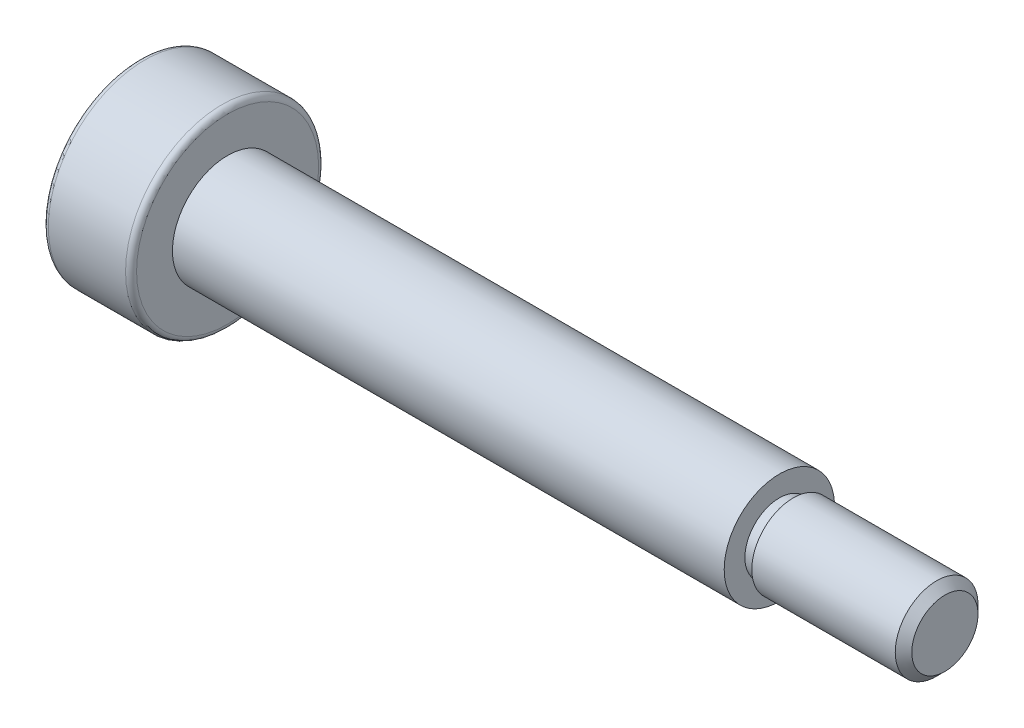
ISO-10303-21;
HEADER;
FILE_DESCRIPTION(('STEP AP214'),'2;1');
FILE_NAME('part.step','',(''),(''),'','','');
FILE_SCHEMA(('AUTOMOTIVE_DESIGN { 1 0 10303 214 1 1 1 1 }'));
ENDSEC;
DATA;
#1=APPLICATION_CONTEXT('core data for automotive mechanical design processes');
#2=APPLICATION_PROTOCOL_DEFINITION('international standard','automotive_design',2000,#1);
#3=PRODUCT_CONTEXT('',#1,'mechanical');
#4=PRODUCT('Part','Part','',(#3));
#5=PRODUCT_RELATED_PRODUCT_CATEGORY('part','',(#4));
#6=PRODUCT_DEFINITION_FORMATION('','',#4);
#7=PRODUCT_DEFINITION_CONTEXT('part definition',#1,'design');
#8=PRODUCT_DEFINITION('design','',#6,#7);
#9=PRODUCT_DEFINITION_SHAPE('','',#8);
#10=(LENGTH_UNIT() NAMED_UNIT(*) SI_UNIT(.MILLI.,.METRE.));
#11=(NAMED_UNIT(*) PLANE_ANGLE_UNIT() SI_UNIT($,.RADIAN.));
#12=(NAMED_UNIT(*) SI_UNIT($,.STERADIAN.) SOLID_ANGLE_UNIT());
#13=UNCERTAINTY_MEASURE_WITH_UNIT(LENGTH_MEASURE(1.E-05),#10,'distance_accuracy_value','');
#14=(GEOMETRIC_REPRESENTATION_CONTEXT(3) GLOBAL_UNCERTAINTY_ASSIGNED_CONTEXT((#13)) GLOBAL_UNIT_ASSIGNED_CONTEXT((#10,
#11,#12)) REPRESENTATION_CONTEXT('',''));
#15=CARTESIAN_POINT('',(0.,0.,0.));
#16=DIRECTION('',(0.,0.,1.));
#17=DIRECTION('',(1.,0.,0.));
#18=AXIS2_PLACEMENT_3D('',#15,#16,#17);
#19=CARTESIAN_POINT('',(-14.6,0.,0.));
#20=DIRECTION('',(1.,0.,0.));
#21=DIRECTION('',(0.,0.,-1.));
#22=AXIS2_PLACEMENT_3D('',#19,#20,#21);
#23=PLANE('',#22);
#24=DIRECTION('',(0.,0.866025403784438,-0.5));
#25=VECTOR('',#24,1.);
#26=CARTESIAN_POINT('',(-14.6,0.,1.73205080756888));
#27=LINE('',#26,#25);
#28=CARTESIAN_POINT('',(-14.6,0.,1.73205080756888));
#29=VERTEX_POINT('',#28);
#30=CARTESIAN_POINT('',(-14.6,1.5,0.866025403784438));
#31=VERTEX_POINT('',#30);
#32=EDGE_CURVE('E127',#29,#31,#27,.T.);
#33=ORIENTED_EDGE('',*,*,#32,.F.);
#34=DIRECTION('',(0.,0.866025403784439,0.5));
#35=VECTOR('',#34,1.);
#36=CARTESIAN_POINT('',(-14.6,-1.5,0.866025403784438));
#37=LINE('',#36,#35);
#38=CARTESIAN_POINT('',(-14.6,-1.5,0.866025403784438));
#39=VERTEX_POINT('',#38);
#40=EDGE_CURVE('E53',#39,#29,#37,.T.);
#41=ORIENTED_EDGE('',*,*,#40,.F.);
#42=DIRECTION('',(0.,0.,1.));
#43=VECTOR('',#42,1.);
#44=CARTESIAN_POINT('',(-14.6,-1.5,-0.866025403784438));
#45=LINE('',#44,#43);
#46=CARTESIAN_POINT('',(-14.6,-1.5,-0.866025403784438));
#47=VERTEX_POINT('',#46);
#48=EDGE_CURVE('E136',#47,#39,#45,.T.);
#49=ORIENTED_EDGE('',*,*,#48,.F.);
#50=DIRECTION('',(0.,-0.866025403784438,0.5));
#51=VECTOR('',#50,1.);
#52=CARTESIAN_POINT('',(-14.6,0.,-1.73205080756888));
#53=LINE('',#52,#51);
#54=CARTESIAN_POINT('',(-14.6,0.,-1.73205080756888));
#55=VERTEX_POINT('',#54);
#56=EDGE_CURVE('E134',#55,#47,#53,.T.);
#57=ORIENTED_EDGE('',*,*,#56,.F.);
#58=DIRECTION('',(0.,-0.866025403784439,-0.5));
#59=VECTOR('',#58,1.);
#60=CARTESIAN_POINT('',(-14.6,1.5,-0.866025403784438));
#61=LINE('',#60,#59);
#62=CARTESIAN_POINT('',(-14.6,1.5,-0.866025403784438));
#63=VERTEX_POINT('',#62);
#64=EDGE_CURVE('E101',#63,#55,#61,.T.);
#65=ORIENTED_EDGE('',*,*,#64,.F.);
#66=DIRECTION('',(0.,0.,-1.));
#67=VECTOR('',#66,1.);
#68=CARTESIAN_POINT('',(-14.6,1.5,0.866025403784438));
#69=LINE('',#68,#67);
#70=EDGE_CURVE('E130',#31,#63,#69,.T.);
#71=ORIENTED_EDGE('',*,*,#70,.F.);
#72=EDGE_LOOP('',(#33,#41,#49,#57,#65,#71));
#73=FACE_BOUND('',#72,.T.);
#74=CARTESIAN_POINT('',(-14.6,0.,0.));
#75=DIRECTION('',(1.,0.,0.));
#76=DIRECTION('',(0.,0.,-1.));
#77=AXIS2_PLACEMENT_3D('',#74,#75,#76);
#78=CIRCLE('',#77,3.3);
#79=CARTESIAN_POINT('',(-14.6,0.,-3.3));
#80=VERTEX_POINT('',#79);
#81=EDGE_CURVE('E169',#80,#80,#78,.F.);
#82=ORIENTED_EDGE('',*,*,#81,.T.);
#83=EDGE_LOOP('',(#82));
#84=FACE_BOUND('',#83,.T.);
#85=ADVANCED_FACE('F37',(#73,#84),#23,.F.);
#86=CARTESIAN_POINT('',(-14.6,0.,0.));
#87=DIRECTION('',(-1.,0.,0.));
#88=DIRECTION('',(0.,0.,1.));
#89=AXIS2_PLACEMENT_3D('',#86,#87,#88);
#90=CYLINDRICAL_SURFACE('',#89,3.5);
#91=CARTESIAN_POINT('',(-11.6,0.,0.));
#92=DIRECTION('',(-1.,0.,0.));
#93=DIRECTION('',(0.,0.,1.));
#94=AXIS2_PLACEMENT_3D('',#91,#92,#93);
#95=CIRCLE('',#94,3.5);
#96=CARTESIAN_POINT('',(-11.6,0.,3.5));
#97=VERTEX_POINT('',#96);
#98=EDGE_CURVE('E163',#97,#97,#95,.T.);
#99=ORIENTED_EDGE('',*,*,#98,.T.);
#100=EDGE_LOOP('',(#99));
#101=FACE_BOUND('',#100,.T.);
#102=CARTESIAN_POINT('',(-14.4,0.,0.));
#103=DIRECTION('',(1.,0.,0.));
#104=DIRECTION('',(0.,0.,-1.));
#105=AXIS2_PLACEMENT_3D('',#102,#103,#104);
#106=CIRCLE('',#105,3.5);
#107=CARTESIAN_POINT('',(-14.4,0.,-3.5));
#108=VERTEX_POINT('',#107);
#109=EDGE_CURVE('E160',#108,#108,#106,.T.);
#110=ORIENTED_EDGE('',*,*,#109,.T.);
#111=EDGE_LOOP('',(#110));
#112=FACE_BOUND('',#111,.T.);
#113=ADVANCED_FACE('F191',(#101,#112),#90,.T.);
#114=CARTESIAN_POINT('',(-11.4,3.5,0.));
#115=DIRECTION('',(-1.,0.,0.));
#116=DIRECTION('',(0.,0.,1.));
#117=AXIS2_PLACEMENT_3D('',#114,#115,#116);
#118=PLANE('',#117);
#119=CARTESIAN_POINT('',(-11.4,0.,0.));
#120=DIRECTION('',(-1.,0.,0.));
#121=DIRECTION('',(0.,0.,1.));
#122=AXIS2_PLACEMENT_3D('',#119,#120,#121);
#123=CIRCLE('',#122,3.3);
#124=CARTESIAN_POINT('',(-11.4,0.,3.3));
#125=VERTEX_POINT('',#124);
#126=EDGE_CURVE('E166',#125,#125,#123,.F.);
#127=ORIENTED_EDGE('',*,*,#126,.T.);
#128=EDGE_LOOP('',(#127));
#129=FACE_BOUND('',#128,.T.);
#130=CARTESIAN_POINT('',(-11.4,0.,0.));
#131=DIRECTION('',(-1.,0.,0.));
#132=DIRECTION('',(0.,0.,1.));
#133=AXIS2_PLACEMENT_3D('',#130,#131,#132);
#134=CIRCLE('',#133,2.);
#135=CARTESIAN_POINT('',(-11.4,0.,2.));
#136=VERTEX_POINT('',#135);
#137=EDGE_CURVE('E157',#136,#136,#134,.T.);
#138=ORIENTED_EDGE('',*,*,#137,.T.);
#139=EDGE_LOOP('',(#138));
#140=FACE_BOUND('',#139,.T.);
#141=ADVANCED_FACE('F197',(#129,#140),#118,.F.);
#142=CARTESIAN_POINT('',(-14.6,0.,0.));
#143=DIRECTION('',(-1.,0.,0.));
#144=DIRECTION('',(0.,0.,1.));
#145=AXIS2_PLACEMENT_3D('',#142,#143,#144);
#146=CYLINDRICAL_SURFACE('',#145,2.);
#147=ORIENTED_EDGE('',*,*,#137,.F.);
#148=EDGE_LOOP('',(#147));
#149=FACE_BOUND('',#148,.T.);
#150=CARTESIAN_POINT('',(8.6,0.,0.));
#151=DIRECTION('',(-1.,0.,0.));
#152=DIRECTION('',(0.,0.,1.));
#153=AXIS2_PLACEMENT_3D('',#150,#151,#152);
#154=CIRCLE('',#153,2.);
#155=CARTESIAN_POINT('',(8.6,0.,2.));
#156=VERTEX_POINT('',#155);
#157=EDGE_CURVE('E154',#156,#156,#154,.T.);
#158=ORIENTED_EDGE('',*,*,#157,.T.);
#159=EDGE_LOOP('',(#158));
#160=FACE_BOUND('',#159,.T.);
#161=ADVANCED_FACE('F231',(#149,#160),#146,.T.);
#162=CARTESIAN_POINT('',(8.6,2.,0.));
#163=DIRECTION('',(-1.,0.,0.));
#164=DIRECTION('',(0.,0.,1.));
#165=AXIS2_PLACEMENT_3D('',#162,#163,#164);
#166=PLANE('',#165);
#167=ORIENTED_EDGE('',*,*,#157,.F.);
#168=EDGE_LOOP('',(#167));
#169=FACE_BOUND('',#168,.T.);
#170=CARTESIAN_POINT('',(8.6,0.,0.));
#171=DIRECTION('',(-1.,0.,0.));
#172=DIRECTION('',(0.,0.,1.));
#173=AXIS2_PLACEMENT_3D('',#170,#171,#172);
#174=CIRCLE('',#173,1.25);
#175=CARTESIAN_POINT('',(8.6,0.,1.25));
#176=VERTEX_POINT('',#175);
#177=EDGE_CURVE('E151',#176,#176,#174,.T.);
#178=ORIENTED_EDGE('',*,*,#177,.T.);
#179=EDGE_LOOP('',(#178));
#180=FACE_BOUND('',#179,.T.);
#181=ADVANCED_FACE('F207',(#169,#180),#166,.F.);
#182=CARTESIAN_POINT('',(-11.6,0.,0.));
#183=DIRECTION('',(-1.,0.,0.));
#184=DIRECTION('',(0.,0.,1.));
#185=AXIS2_PLACEMENT_3D('',#182,#183,#184);
#186=TOROIDAL_SURFACE('',#185,3.3,0.2);
#187=ORIENTED_EDGE('',*,*,#126,.F.);
#188=EDGE_LOOP('',(#187));
#189=FACE_BOUND('',#188,.T.);
#190=ORIENTED_EDGE('',*,*,#98,.F.);
#191=EDGE_LOOP('',(#190));
#192=FACE_BOUND('',#191,.T.);
#193=ADVANCED_FACE('F204',(#189,#192),#186,.T.);
#194=CARTESIAN_POINT('',(-14.4,0.,0.));
#195=DIRECTION('',(1.,0.,0.));
#196=DIRECTION('',(0.,0.,-1.));
#197=AXIS2_PLACEMENT_3D('',#194,#195,#196);
#198=TOROIDAL_SURFACE('',#197,3.3,0.2);
#199=ORIENTED_EDGE('',*,*,#109,.F.);
#200=EDGE_LOOP('',(#199));
#201=FACE_BOUND('',#200,.T.);
#202=ORIENTED_EDGE('',*,*,#81,.F.);
#203=EDGE_LOOP('',(#202));
#204=FACE_BOUND('',#203,.T.);
#205=ADVANCED_FACE('F206',(#201,#204),#198,.T.);
#206=CARTESIAN_POINT('',(8.6,0.,0.));
#207=DIRECTION('',(-1.,0.,0.));
#208=DIRECTION('',(0.,0.,1.));
#209=AXIS2_PLACEMENT_3D('',#206,#207,#208);
#210=CYLINDRICAL_SURFACE('',#209,1.25);
#211=CARTESIAN_POINT('',(9.1,0.,0.));
#212=DIRECTION('',(-1.,0.,0.));
#213=DIRECTION('',(0.,0.,1.));
#214=AXIS2_PLACEMENT_3D('',#211,#212,#213);
#215=CIRCLE('',#214,1.25);
#216=CARTESIAN_POINT('',(9.1,0.,1.25));
#217=VERTEX_POINT('',#216);
#218=EDGE_CURVE('E148',#217,#217,#215,.T.);
#219=ORIENTED_EDGE('',*,*,#218,.T.);
#220=EDGE_LOOP('',(#219));
#221=FACE_BOUND('',#220,.T.);
#222=ORIENTED_EDGE('',*,*,#177,.F.);
#223=EDGE_LOOP('',(#222));
#224=FACE_BOUND('',#223,.T.);
#225=ADVANCED_FACE('F210',(#221,#224),#210,.T.);
#226=CARTESIAN_POINT('',(9.1,1.5,0.));
#227=DIRECTION('',(-1.,0.,0.));
#228=DIRECTION('',(0.,0.,1.));
#229=AXIS2_PLACEMENT_3D('',#226,#227,#228);
#230=PLANE('',#229);
#231=CARTESIAN_POINT('',(9.1,0.,0.));
#232=DIRECTION('',(-1.,0.,0.));
#233=DIRECTION('',(0.,0.,1.));
#234=AXIS2_PLACEMENT_3D('',#231,#232,#233);
#235=CIRCLE('',#234,1.5);
#236=CARTESIAN_POINT('',(9.1,0.,1.5));
#237=VERTEX_POINT('',#236);
#238=EDGE_CURVE('E140',#237,#237,#235,.T.);
#239=ORIENTED_EDGE('',*,*,#238,.T.);
#240=EDGE_LOOP('',(#239));
#241=FACE_BOUND('',#240,.T.);
#242=ORIENTED_EDGE('',*,*,#218,.F.);
#243=EDGE_LOOP('',(#242));
#244=FACE_BOUND('',#243,.T.);
#245=ADVANCED_FACE('F186',(#241,#244),#230,.T.);
#246=CARTESIAN_POINT('',(14.6,1.5,0.));
#247=DIRECTION('',(-1.,0.,0.));
#248=DIRECTION('',(0.,0.,1.));
#249=AXIS2_PLACEMENT_3D('',#246,#247,#248);
#250=PLANE('',#249);
#251=CARTESIAN_POINT('',(14.6,0.,0.));
#252=DIRECTION('',(-1.,0.,0.));
#253=DIRECTION('',(0.,0.,1.));
#254=AXIS2_PLACEMENT_3D('',#251,#252,#253);
#255=CIRCLE('',#254,1.2);
#256=CARTESIAN_POINT('',(14.6,0.,1.2));
#257=VERTEX_POINT('',#256);
#258=EDGE_CURVE('E11',#257,#257,#255,.F.);
#259=ORIENTED_EDGE('',*,*,#258,.T.);
#260=EDGE_LOOP('',(#259));
#261=FACE_BOUND('',#260,.T.);
#262=ADVANCED_FACE('F178',(#261),#250,.F.);
#263=CARTESIAN_POINT('',(14.3,0.,0.));
#264=DIRECTION('',(-1.,0.,0.));
#265=DIRECTION('',(0.,0.,1.));
#266=AXIS2_PLACEMENT_3D('',#263,#264,#265);
#267=CONICAL_SURFACE('',#266,1.5,0.785398163397452);
#268=ORIENTED_EDGE('',*,*,#258,.F.);
#269=EDGE_LOOP('',(#268));
#270=FACE_BOUND('',#269,.T.);
#271=CARTESIAN_POINT('',(14.3,0.,0.));
#272=DIRECTION('',(-1.,0.,0.));
#273=DIRECTION('',(0.,0.,1.));
#274=AXIS2_PLACEMENT_3D('',#271,#272,#273);
#275=CIRCLE('',#274,1.5);
#276=CARTESIAN_POINT('',(14.3,0.,1.5));
#277=VERTEX_POINT('',#276);
#278=EDGE_CURVE('E46',#277,#277,#275,.T.);
#279=ORIENTED_EDGE('',*,*,#278,.F.);
#280=EDGE_LOOP('',(#279));
#281=FACE_BOUND('',#280,.T.);
#282=ADVANCED_FACE('F40',(#270,#281),#267,.T.);
#283=CARTESIAN_POINT('',(-14.6,0.,0.));
#284=DIRECTION('',(-1.,0.,0.));
#285=DIRECTION('',(0.,0.,1.));
#286=AXIS2_PLACEMENT_3D('',#283,#284,#285);
#287=CYLINDRICAL_SURFACE('',#286,1.5);
#288=ORIENTED_EDGE('',*,*,#278,.T.);
#289=EDGE_LOOP('',(#288));
#290=FACE_BOUND('',#289,.T.);
#291=ORIENTED_EDGE('',*,*,#238,.F.);
#292=EDGE_LOOP('',(#291));
#293=FACE_BOUND('',#292,.T.);
#294=ADVANCED_FACE('F174',(#290,#293),#287,.T.);
#295=CARTESIAN_POINT('',(-12.6,-1.5,0.866025403784438));
#296=DIRECTION('',(0.,-0.5,0.866025403784439));
#297=DIRECTION('',(0.,-0.866025403784439,-0.5));
#298=AXIS2_PLACEMENT_3D('',#295,#296,#297);
#299=PLANE('',#298);
#300=ORIENTED_EDGE('',*,*,#40,.T.);
#301=DIRECTION('',(-1.,0.,0.));
#302=VECTOR('',#301,1.);
#303=CARTESIAN_POINT('',(-12.6,0.,1.73205080756888));
#304=LINE('',#303,#302);
#305=CARTESIAN_POINT('',(-12.6,0.,1.73205080756888));
#306=VERTEX_POINT('',#305);
#307=EDGE_CURVE('E83',#306,#29,#304,.T.);
#308=ORIENTED_EDGE('',*,*,#307,.F.);
#309=DIRECTION('',(0.,0.866025403784439,0.5));
#310=VECTOR('',#309,1.);
#311=CARTESIAN_POINT('',(-12.6,-1.5,0.866025403784438));
#312=LINE('',#311,#310);
#313=CARTESIAN_POINT('',(-12.6,-1.5,0.866025403784438));
#314=VERTEX_POINT('',#313);
#315=EDGE_CURVE('E138',#314,#306,#312,.T.);
#316=ORIENTED_EDGE('',*,*,#315,.F.);
#317=DIRECTION('',(-1.,0.,0.));
#318=VECTOR('',#317,1.);
#319=CARTESIAN_POINT('',(-12.6,-1.5,0.866025403784438));
#320=LINE('',#319,#318);
#321=EDGE_CURVE('E61',#314,#39,#320,.T.);
#322=ORIENTED_EDGE('',*,*,#321,.T.);
#323=EDGE_LOOP('',(#300,#308,#316,#322));
#324=FACE_BOUND('',#323,.T.);
#325=ADVANCED_FACE('F184',(#324),#299,.F.);
#326=CARTESIAN_POINT('',(-12.6,-1.5,-0.866025403784438));
#327=DIRECTION('',(0.,-1.,0.));
#328=DIRECTION('',(0.,0.,-1.));
#329=AXIS2_PLACEMENT_3D('',#326,#327,#328);
#330=PLANE('',#329);
#331=ORIENTED_EDGE('',*,*,#48,.T.);
#332=ORIENTED_EDGE('',*,*,#321,.F.);
#333=DIRECTION('',(0.,0.,1.));
#334=VECTOR('',#333,1.);
#335=CARTESIAN_POINT('',(-12.6,-1.5,-0.866025403784438));
#336=LINE('',#335,#334);
#337=CARTESIAN_POINT('',(-12.6,-1.5,-0.866025403784438));
#338=VERTEX_POINT('',#337);
#339=EDGE_CURVE('E113',#338,#314,#336,.T.);
#340=ORIENTED_EDGE('',*,*,#339,.F.);
#341=DIRECTION('',(-1.,0.,0.));
#342=VECTOR('',#341,1.);
#343=CARTESIAN_POINT('',(-12.6,-1.5,-0.866025403784438));
#344=LINE('',#343,#342);
#345=EDGE_CURVE('E105',#338,#47,#344,.T.);
#346=ORIENTED_EDGE('',*,*,#345,.T.);
#347=EDGE_LOOP('',(#331,#332,#340,#346));
#348=FACE_BOUND('',#347,.T.);
#349=ADVANCED_FACE('F305',(#348),#330,.F.);
#350=CARTESIAN_POINT('',(-12.6,0.,-1.73205080756888));
#351=DIRECTION('',(0.,-0.5,-0.866025403784438));
#352=DIRECTION('',(0.,0.866025403784439,-0.5));
#353=AXIS2_PLACEMENT_3D('',#350,#351,#352);
#354=PLANE('',#353);
#355=ORIENTED_EDGE('',*,*,#56,.T.);
#356=ORIENTED_EDGE('',*,*,#345,.F.);
#357=DIRECTION('',(0.,-0.866025403784438,0.5));
#358=VECTOR('',#357,1.);
#359=CARTESIAN_POINT('',(-12.6,0.,-1.73205080756888));
#360=LINE('',#359,#358);
#361=CARTESIAN_POINT('',(-12.6,0.,-1.73205080756888));
#362=VERTEX_POINT('',#361);
#363=EDGE_CURVE('E109',#362,#338,#360,.T.);
#364=ORIENTED_EDGE('',*,*,#363,.F.);
#365=DIRECTION('',(-1.,0.,0.));
#366=VECTOR('',#365,1.);
#367=CARTESIAN_POINT('',(-12.6,0.,-1.73205080756888));
#368=LINE('',#367,#366);
#369=EDGE_CURVE('E94',#362,#55,#368,.T.);
#370=ORIENTED_EDGE('',*,*,#369,.T.);
#371=EDGE_LOOP('',(#355,#356,#364,#370));
#372=FACE_BOUND('',#371,.T.);
#373=ADVANCED_FACE('F110',(#372),#354,.F.);
#374=CARTESIAN_POINT('',(-12.6,1.5,-0.866025403784438));
#375=DIRECTION('',(0.,0.5,-0.866025403784439));
#376=DIRECTION('',(0.,0.866025403784439,0.5));
#377=AXIS2_PLACEMENT_3D('',#374,#375,#376);
#378=PLANE('',#377);
#379=ORIENTED_EDGE('',*,*,#64,.T.);
#380=ORIENTED_EDGE('',*,*,#369,.F.);
#381=DIRECTION('',(0.,-0.866025403784439,-0.5));
#382=VECTOR('',#381,1.);
#383=CARTESIAN_POINT('',(-12.6,1.5,-0.866025403784438));
#384=LINE('',#383,#382);
#385=CARTESIAN_POINT('',(-12.6,1.5,-0.866025403784438));
#386=VERTEX_POINT('',#385);
#387=EDGE_CURVE('E98',#386,#362,#384,.T.);
#388=ORIENTED_EDGE('',*,*,#387,.F.);
#389=DIRECTION('',(-1.,0.,0.));
#390=VECTOR('',#389,1.);
#391=CARTESIAN_POINT('',(-12.6,1.5,-0.866025403784438));
#392=LINE('',#391,#390);
#393=EDGE_CURVE('E106',#386,#63,#392,.T.);
#394=ORIENTED_EDGE('',*,*,#393,.T.);
#395=EDGE_LOOP('',(#379,#380,#388,#394));
#396=FACE_BOUND('',#395,.T.);
#397=ADVANCED_FACE('F96',(#396),#378,.F.);
#398=CARTESIAN_POINT('',(-12.6,1.5,0.866025403784438));
#399=DIRECTION('',(0.,1.,0.));
#400=DIRECTION('',(0.,0.,1.));
#401=AXIS2_PLACEMENT_3D('',#398,#399,#400);
#402=PLANE('',#401);
#403=ORIENTED_EDGE('',*,*,#70,.T.);
#404=ORIENTED_EDGE('',*,*,#393,.F.);
#405=DIRECTION('',(0.,0.,-1.));
#406=VECTOR('',#405,1.);
#407=CARTESIAN_POINT('',(-12.6,1.5,0.866025403784438));
#408=LINE('',#407,#406);
#409=CARTESIAN_POINT('',(-12.6,1.5,0.866025403784438));
#410=VERTEX_POINT('',#409);
#411=EDGE_CURVE('E119',#410,#386,#408,.T.);
#412=ORIENTED_EDGE('',*,*,#411,.F.);
#413=DIRECTION('',(-1.,0.,0.));
#414=VECTOR('',#413,1.);
#415=CARTESIAN_POINT('',(-12.6,1.5,0.866025403784438));
#416=LINE('',#415,#414);
#417=EDGE_CURVE('E143',#410,#31,#416,.T.);
#418=ORIENTED_EDGE('',*,*,#417,.T.);
#419=EDGE_LOOP('',(#403,#404,#412,#418));
#420=FACE_BOUND('',#419,.T.);
#421=ADVANCED_FACE('F326',(#420),#402,.F.);
#422=CARTESIAN_POINT('',(-12.6,0.,1.73205080756888));
#423=DIRECTION('',(0.,0.5,0.866025403784438));
#424=DIRECTION('',(0.,-0.866025403784439,0.5));
#425=AXIS2_PLACEMENT_3D('',#422,#423,#424);
#426=PLANE('',#425);
#427=ORIENTED_EDGE('',*,*,#32,.T.);
#428=ORIENTED_EDGE('',*,*,#417,.F.);
#429=DIRECTION('',(0.,0.866025403784438,-0.5));
#430=VECTOR('',#429,1.);
#431=CARTESIAN_POINT('',(-12.6,0.,1.73205080756888));
#432=LINE('',#431,#430);
#433=EDGE_CURVE('E121',#306,#410,#432,.T.);
#434=ORIENTED_EDGE('',*,*,#433,.F.);
#435=ORIENTED_EDGE('',*,*,#307,.T.);
#436=EDGE_LOOP('',(#427,#428,#434,#435));
#437=FACE_BOUND('',#436,.T.);
#438=ADVANCED_FACE('F334',(#437),#426,.F.);
#439=CARTESIAN_POINT('',(-12.6,0.,0.));
#440=DIRECTION('',(-1.,0.,0.));
#441=DIRECTION('',(0.,0.,1.));
#442=AXIS2_PLACEMENT_3D('',#439,#440,#441);
#443=PLANE('',#442);
#444=ORIENTED_EDGE('',*,*,#315,.T.);
#445=ORIENTED_EDGE('',*,*,#433,.T.);
#446=ORIENTED_EDGE('',*,*,#411,.T.);
#447=ORIENTED_EDGE('',*,*,#387,.T.);
#448=ORIENTED_EDGE('',*,*,#363,.T.);
#449=ORIENTED_EDGE('',*,*,#339,.T.);
#450=EDGE_LOOP('',(#444,#445,#446,#447,#448,#449));
#451=FACE_BOUND('',#450,.T.);
#452=ADVANCED_FACE('F116',(#451),#443,.T.);
#453=CLOSED_SHELL('',(#85,#113,#141,#161,#181,#193,#205,#225,#245,#262,#282,#294,#325,#349,#373,
#397,#421,#438,#452));
#454=MANIFOLD_SOLID_BREP('B2',#453);
#455=ADVANCED_BREP_SHAPE_REPRESENTATION('',(#18,#454),#14);
#456=SHAPE_DEFINITION_REPRESENTATION(#9,#455);
ENDSEC;
END-ISO-10303-21;
